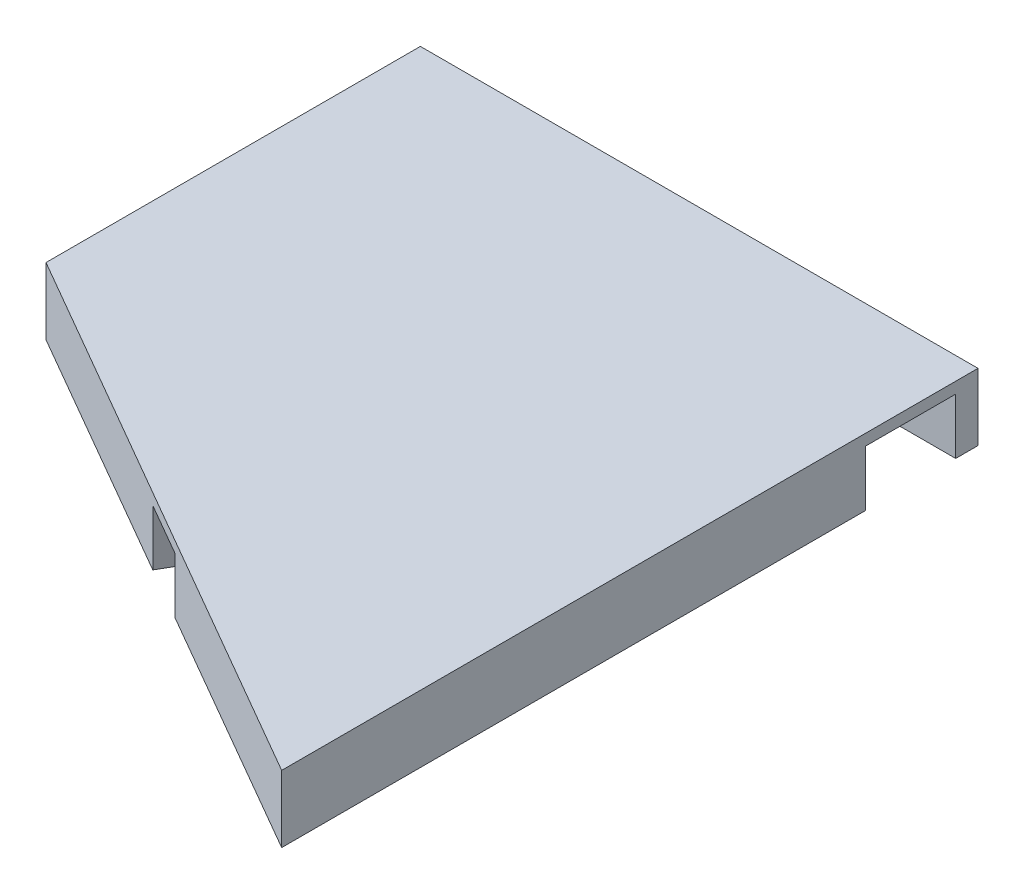
ISO-10303-21;
HEADER;
FILE_DESCRIPTION(('STEP AP214'),'2;1');
FILE_NAME('part.step','',(''),(''),'','','');
FILE_SCHEMA(('AUTOMOTIVE_DESIGN { 1 0 10303 214 1 1 1 1 }'));
ENDSEC;
DATA;
#1=APPLICATION_CONTEXT('core data for automotive mechanical design processes');
#2=APPLICATION_PROTOCOL_DEFINITION('international standard','automotive_design',2000,#1);
#3=PRODUCT_CONTEXT('',#1,'mechanical');
#4=PRODUCT('Part','Part','',(#3));
#5=PRODUCT_RELATED_PRODUCT_CATEGORY('part','',(#4));
#6=PRODUCT_DEFINITION_FORMATION('','',#4);
#7=PRODUCT_DEFINITION_CONTEXT('part definition',#1,'design');
#8=PRODUCT_DEFINITION('design','',#6,#7);
#9=PRODUCT_DEFINITION_SHAPE('','',#8);
#10=(LENGTH_UNIT() NAMED_UNIT(*) SI_UNIT(.MILLI.,.METRE.));
#11=(NAMED_UNIT(*) PLANE_ANGLE_UNIT() SI_UNIT($,.RADIAN.));
#12=(NAMED_UNIT(*) SI_UNIT($,.STERADIAN.) SOLID_ANGLE_UNIT());
#13=UNCERTAINTY_MEASURE_WITH_UNIT(LENGTH_MEASURE(1.E-05),#10,'distance_accuracy_value','');
#14=(GEOMETRIC_REPRESENTATION_CONTEXT(3) GLOBAL_UNCERTAINTY_ASSIGNED_CONTEXT((#13)) GLOBAL_UNIT_ASSIGNED_CONTEXT((#10,
#11,#12)) REPRESENTATION_CONTEXT('',''));
#15=CARTESIAN_POINT('',(0.,0.,0.));
#16=DIRECTION('',(0.,0.,1.));
#17=DIRECTION('',(1.,0.,0.));
#18=AXIS2_PLACEMENT_3D('',#15,#16,#17);
#19=CARTESIAN_POINT('',(0.,0.,0.));
#20=DIRECTION('',(-1.,0.,0.));
#21=DIRECTION('',(0.,0.,1.));
#22=AXIS2_PLACEMENT_3D('',#19,#20,#21);
#23=PLANE('',#22);
#24=DIRECTION('',(0.,1.,0.));
#25=VECTOR('',#24,1.);
#26=CARTESIAN_POINT('',(0.,5.,5.39999999999995));
#27=LINE('',#26,#25);
#28=CARTESIAN_POINT('',(0.,0.,5.39999999999996));
#29=VERTEX_POINT('',#28);
#30=CARTESIAN_POINT('',(0.,5.,5.39999999999996));
#31=VERTEX_POINT('',#30);
#32=EDGE_CURVE('E13',#29,#31,#27,.T.);
#33=ORIENTED_EDGE('',*,*,#32,.T.);
#34=DIRECTION('',(0.,0.,1.));
#35=VECTOR('',#34,1.);
#36=CARTESIAN_POINT('',(0.,5.,0.));
#37=LINE('',#36,#35);
#38=CARTESIAN_POINT('',(0.,5.,-2.7));
#39=VERTEX_POINT('',#38);
#40=EDGE_CURVE('E144',#39,#31,#37,.T.);
#41=ORIENTED_EDGE('',*,*,#40,.F.);
#42=DIRECTION('',(0.,-1.,0.));
#43=VECTOR('',#42,1.);
#44=CARTESIAN_POINT('',(0.,5.,-2.7));
#45=LINE('',#44,#43);
#46=CARTESIAN_POINT('',(0.,0.,-2.7));
#47=VERTEX_POINT('',#46);
#48=EDGE_CURVE('E257',#39,#47,#45,.T.);
#49=ORIENTED_EDGE('',*,*,#48,.T.);
#50=DIRECTION('',(0.,0.,1.));
#51=VECTOR('',#50,1.);
#52=CARTESIAN_POINT('',(0.,0.,0.));
#53=LINE('',#52,#51);
#54=CARTESIAN_POINT('',(0.,0.,-4.7));
#55=VERTEX_POINT('',#54);
#56=EDGE_CURVE('E262',#55,#47,#53,.T.);
#57=ORIENTED_EDGE('',*,*,#56,.F.);
#58=DIRECTION('',(0.,1.,0.));
#59=VECTOR('',#58,1.);
#60=CARTESIAN_POINT('',(0.,160.280048396847,-4.7));
#61=LINE('',#60,#59);
#62=CARTESIAN_POINT('',(0.,6.00000000000001,-4.7));
#63=VERTEX_POINT('',#62);
#64=EDGE_CURVE('E212',#55,#63,#61,.T.);
#65=ORIENTED_EDGE('',*,*,#64,.T.);
#66=DIRECTION('',(0.,0.,1.));
#67=VECTOR('',#66,1.);
#68=CARTESIAN_POINT('',(0.,6.,0.));
#69=LINE('',#68,#67);
#70=CARTESIAN_POINT('',(0.,6.,57.7350269189626));
#71=VERTEX_POINT('',#70);
#72=EDGE_CURVE('E258',#63,#71,#69,.T.);
#73=ORIENTED_EDGE('',*,*,#72,.T.);
#74=DIRECTION('',(0.,-1.,0.));
#75=VECTOR('',#74,1.);
#76=CARTESIAN_POINT('',(0.,6.,57.7350269189626));
#77=LINE('',#76,#75);
#78=CARTESIAN_POINT('',(0.,0.,57.7350269189626));
#79=VERTEX_POINT('',#78);
#80=EDGE_CURVE('E130',#71,#79,#77,.T.);
#81=ORIENTED_EDGE('',*,*,#80,.T.);
#82=DIRECTION('',(0.,0.,1.));
#83=VECTOR('',#82,1.);
#84=CARTESIAN_POINT('',(0.,0.,0.));
#85=LINE('',#84,#83);
#86=EDGE_CURVE('E124',#29,#79,#85,.T.);
#87=ORIENTED_EDGE('',*,*,#86,.F.);
#88=EDGE_LOOP('',(#33,#41,#49,#57,#65,#73,#81,#87));
#89=FACE_BOUND('',#88,.T.);
#90=ADVANCED_FACE('F121',(#89),#23,.F.);
#91=CARTESIAN_POINT('',(0.,0.,0.));
#92=DIRECTION('',(0.,1.,0.));
#93=DIRECTION('',(0.,0.,1.));
#94=AXIS2_PLACEMENT_3D('',#91,#92,#93);
#95=PLANE('',#94);
#96=DIRECTION('',(1.,0.,0.));
#97=VECTOR('',#96,1.);
#98=CARTESIAN_POINT('',(-50.,0.,-4.7));
#99=LINE('',#98,#97);
#100=CARTESIAN_POINT('',(-50.,0.,-4.7));
#101=VERTEX_POINT('',#100);
#102=EDGE_CURVE('E205',#101,#55,#99,.T.);
#103=ORIENTED_EDGE('',*,*,#102,.T.);
#104=ORIENTED_EDGE('',*,*,#56,.T.);
#105=DIRECTION('',(-1.,0.,0.));
#106=VECTOR('',#105,1.);
#107=CARTESIAN_POINT('',(50.,0.,-2.7));
#108=LINE('',#107,#106);
#109=CARTESIAN_POINT('',(-50.,0.,-2.7));
#110=VERTEX_POINT('',#109);
#111=EDGE_CURVE('E232',#47,#110,#108,.T.);
#112=ORIENTED_EDGE('',*,*,#111,.T.);
#113=DIRECTION('',(0.,0.,1.));
#114=VECTOR('',#113,1.);
#115=CARTESIAN_POINT('',(-50.,0.,0.));
#116=LINE('',#115,#114);
#117=EDGE_CURVE('E224',#101,#110,#116,.T.);
#118=ORIENTED_EDGE('',*,*,#117,.F.);
#119=EDGE_LOOP('',(#103,#104,#112,#118));
#120=FACE_BOUND('',#119,.T.);
#121=ADVANCED_FACE('F230',(#120),#95,.F.);
#122=CARTESIAN_POINT('',(-50.,6.,0.));
#123=DIRECTION('',(1.,0.,0.));
#124=DIRECTION('',(0.,0.,-1.));
#125=AXIS2_PLACEMENT_3D('',#122,#123,#124);
#126=PLANE('',#125);
#127=DIRECTION('',(0.,-1.,0.));
#128=VECTOR('',#127,1.);
#129=CARTESIAN_POINT('',(-50.,160.280048396847,-4.7));
#130=LINE('',#129,#128);
#131=CARTESIAN_POINT('',(-50.,6.,-4.7));
#132=VERTEX_POINT('',#131);
#133=EDGE_CURVE('E209',#132,#101,#130,.T.);
#134=ORIENTED_EDGE('',*,*,#133,.T.);
#135=ORIENTED_EDGE('',*,*,#117,.T.);
#136=DIRECTION('',(0.,-1.,0.));
#137=VECTOR('',#136,1.);
#138=CARTESIAN_POINT('',(-50.,5.,-2.7));
#139=LINE('',#138,#137);
#140=CARTESIAN_POINT('',(-50.,5.,-2.7));
#141=VERTEX_POINT('',#140);
#142=EDGE_CURVE('E314',#141,#110,#139,.T.);
#143=ORIENTED_EDGE('',*,*,#142,.F.);
#144=DIRECTION('',(0.,0.,1.));
#145=VECTOR('',#144,1.);
#146=CARTESIAN_POINT('',(-50.,5.,-2.7));
#147=LINE('',#146,#145);
#148=CARTESIAN_POINT('',(-50.,5.,2.7));
#149=VERTEX_POINT('',#148);
#150=EDGE_CURVE('E335',#141,#149,#147,.T.);
#151=ORIENTED_EDGE('',*,*,#150,.T.);
#152=DIRECTION('',(0.,-1.,0.));
#153=VECTOR('',#152,1.);
#154=CARTESIAN_POINT('',(-50.,5.,2.7));
#155=LINE('',#154,#153);
#156=CARTESIAN_POINT('',(-50.,0.,2.7));
#157=VERTEX_POINT('',#156);
#158=EDGE_CURVE('E321',#149,#157,#155,.T.);
#159=ORIENTED_EDGE('',*,*,#158,.T.);
#160=CARTESIAN_POINT('',(-50.,0.,28.8675134594813));
#161=VERTEX_POINT('',#160);
#162=EDGE_CURVE('E235',#157,#161,#116,.T.);
#163=ORIENTED_EDGE('',*,*,#162,.T.);
#164=DIRECTION('',(0.,-1.,0.));
#165=VECTOR('',#164,1.);
#166=CARTESIAN_POINT('',(-50.,6.,28.8675134594813));
#167=LINE('',#166,#165);
#168=CARTESIAN_POINT('',(-50.,6.,28.8675134594813));
#169=VERTEX_POINT('',#168);
#170=EDGE_CURVE('E251',#169,#161,#167,.T.);
#171=ORIENTED_EDGE('',*,*,#170,.F.);
#172=DIRECTION('',(0.,0.,1.));
#173=VECTOR('',#172,1.);
#174=CARTESIAN_POINT('',(-50.,6.,0.));
#175=LINE('',#174,#173);
#176=EDGE_CURVE('E227',#132,#169,#175,.T.);
#177=ORIENTED_EDGE('',*,*,#176,.F.);
#178=EDGE_LOOP('',(#134,#135,#143,#151,#159,#163,#171,#177));
#179=FACE_BOUND('',#178,.T.);
#180=ADVANCED_FACE('F222',(#179),#126,.F.);
#181=CARTESIAN_POINT('',(0.,6.,0.));
#182=DIRECTION('',(0.,1.,0.));
#183=DIRECTION('',(0.,0.,1.));
#184=AXIS2_PLACEMENT_3D('',#181,#182,#183);
#185=PLANE('',#184);
#186=ORIENTED_EDGE('',*,*,#72,.F.);
#187=DIRECTION('',(1.,0.,0.));
#188=VECTOR('',#187,1.);
#189=CARTESIAN_POINT('',(-50.,6.00000000000001,-4.7));
#190=LINE('',#189,#188);
#191=EDGE_CURVE('E217',#132,#63,#190,.T.);
#192=ORIENTED_EDGE('',*,*,#191,.F.);
#193=ORIENTED_EDGE('',*,*,#176,.T.);
#194=DIRECTION('',(0.866025403784439,0.,0.5));
#195=VECTOR('',#194,1.);
#196=CARTESIAN_POINT('',(-25.,6.,43.3012701892219));
#197=LINE('',#196,#195);
#198=EDGE_CURVE('E244',#169,#71,#197,.T.);
#199=ORIENTED_EDGE('',*,*,#198,.T.);
#200=EDGE_LOOP('',(#186,#192,#193,#199));
#201=FACE_BOUND('',#200,.T.);
#202=ADVANCED_FACE('F296',(#201),#185,.T.);
#203=DIRECTION('',(0.5,0.,-0.866025403784439));
#204=VECTOR('',#203,1.);
#205=CARTESIAN_POINT('',(-22.661731409782,0.,44.6512701892219));
#206=LINE('',#205,#204);
#207=CARTESIAN_POINT('',(-22.661731409782,0.,44.6512701892219));
#208=VERTEX_POINT('',#207);
#209=EDGE_CURVE('E273',#208,#29,#206,.T.);
#210=ORIENTED_EDGE('',*,*,#209,.T.);
#211=ORIENTED_EDGE('',*,*,#86,.T.);
#212=DIRECTION('',(0.866025403784439,0.,0.5));
#213=VECTOR('',#212,1.);
#214=CARTESIAN_POINT('',(-25.,0.,43.3012701892219));
#215=LINE('',#214,#213);
#216=EDGE_CURVE('E234',#208,#79,#215,.T.);
#217=ORIENTED_EDGE('',*,*,#216,.F.);
#218=EDGE_LOOP('',(#210,#211,#217));
#219=FACE_BOUND('',#218,.T.);
#220=ADVANCED_FACE('F272',(#219),#95,.F.);
#221=CARTESIAN_POINT('',(-25.,6.,43.3012701892219));
#222=DIRECTION('',(0.5,0.,-0.866025403784438));
#223=DIRECTION('',(-0.866025403784439,0.,-0.5));
#224=AXIS2_PLACEMENT_3D('',#221,#222,#223);
#225=PLANE('',#224);
#226=CARTESIAN_POINT('',(-27.338268590218,0.,41.9512701892219));
#227=VERTEX_POINT('',#226);
#228=EDGE_CURVE('E240',#161,#227,#215,.T.);
#229=ORIENTED_EDGE('',*,*,#228,.T.);
#230=DIRECTION('',(0.,-1.,0.));
#231=VECTOR('',#230,1.);
#232=CARTESIAN_POINT('',(-27.338268590218,5.,41.9512701892219));
#233=LINE('',#232,#231);
#234=CARTESIAN_POINT('',(-27.338268590218,5.,41.9512701892219));
#235=VERTEX_POINT('',#234);
#236=EDGE_CURVE('E242',#235,#227,#233,.T.);
#237=ORIENTED_EDGE('',*,*,#236,.F.);
#238=DIRECTION('',(0.866025403784439,0.,0.499999999999999));
#239=VECTOR('',#238,1.);
#240=CARTESIAN_POINT('',(-27.338268590218,5.,41.9512701892219));
#241=LINE('',#240,#239);
#242=CARTESIAN_POINT('',(-22.661731409782,5.,44.6512701892219));
#243=VERTEX_POINT('',#242);
#244=EDGE_CURVE('E282',#235,#243,#241,.T.);
#245=ORIENTED_EDGE('',*,*,#244,.T.);
#246=DIRECTION('',(0.,-1.,0.));
#247=VECTOR('',#246,1.);
#248=CARTESIAN_POINT('',(-22.661731409782,5.,44.6512701892219));
#249=LINE('',#248,#247);
#250=EDGE_CURVE('E280',#243,#208,#249,.T.);
#251=ORIENTED_EDGE('',*,*,#250,.T.);
#252=ORIENTED_EDGE('',*,*,#216,.T.);
#253=ORIENTED_EDGE('',*,*,#80,.F.);
#254=ORIENTED_EDGE('',*,*,#198,.F.);
#255=ORIENTED_EDGE('',*,*,#170,.T.);
#256=EDGE_LOOP('',(#229,#237,#245,#251,#252,#253,#254,#255));
#257=FACE_BOUND('',#256,.T.);
#258=ADVANCED_FACE('F278',(#257),#225,.F.);
#259=DIRECTION('',(-1.,0.,0.));
#260=VECTOR('',#259,1.);
#261=CARTESIAN_POINT('',(50.,0.,2.7));
#262=LINE('',#261,#260);
#263=CARTESIAN_POINT('',(-4.67653718043599,0.,2.7));
#264=VERTEX_POINT('',#263);
#265=EDGE_CURVE('E305',#264,#157,#262,.T.);
#266=ORIENTED_EDGE('',*,*,#265,.F.);
#267=DIRECTION('',(0.5,0.,-0.866025403784439));
#268=VECTOR('',#267,1.);
#269=CARTESIAN_POINT('',(-27.338268590218,0.,41.9512701892219));
#270=LINE('',#269,#268);
#271=EDGE_CURVE('E304',#227,#264,#270,.T.);
#272=ORIENTED_EDGE('',*,*,#271,.F.);
#273=ORIENTED_EDGE('',*,*,#228,.F.);
#274=ORIENTED_EDGE('',*,*,#162,.F.);
#275=EDGE_LOOP('',(#266,#272,#273,#274));
#276=FACE_BOUND('',#275,.T.);
#277=ADVANCED_FACE('F302',(#276),#95,.F.);
#278=CARTESIAN_POINT('',(-27.338268590218,5.,41.9512701892219));
#279=DIRECTION('',(-0.866025403784439,0.,-0.5));
#280=DIRECTION('',(-0.5,0.,0.866025403784439));
#281=AXIS2_PLACEMENT_3D('',#278,#279,#280);
#282=PLANE('',#281);
#283=DIRECTION('',(0.,1.,0.));
#284=VECTOR('',#283,1.);
#285=CARTESIAN_POINT('',(-4.67653718043599,5.,2.7));
#286=LINE('',#285,#284);
#287=CARTESIAN_POINT('',(-4.67653718043599,5.,2.7));
#288=VERTEX_POINT('',#287);
#289=EDGE_CURVE('E309',#264,#288,#286,.T.);
#290=ORIENTED_EDGE('',*,*,#289,.T.);
#291=DIRECTION('',(0.5,0.,-0.866025403784439));
#292=VECTOR('',#291,1.);
#293=CARTESIAN_POINT('',(-27.338268590218,5.,41.9512701892219));
#294=LINE('',#293,#292);
#295=EDGE_CURVE('E313',#235,#288,#294,.T.);
#296=ORIENTED_EDGE('',*,*,#295,.F.);
#297=ORIENTED_EDGE('',*,*,#236,.T.);
#298=ORIENTED_EDGE('',*,*,#271,.T.);
#299=EDGE_LOOP('',(#290,#296,#297,#298));
#300=FACE_BOUND('',#299,.T.);
#301=ADVANCED_FACE('F352',(#300),#282,.F.);
#302=CARTESIAN_POINT('',(-22.661731409782,5.,44.6512701892219));
#303=DIRECTION('',(-0.866025403784439,0.,-0.5));
#304=DIRECTION('',(-0.5,0.,0.866025403784439));
#305=AXIS2_PLACEMENT_3D('',#302,#303,#304);
#306=PLANE('',#305);
#307=ORIENTED_EDGE('',*,*,#209,.F.);
#308=ORIENTED_EDGE('',*,*,#250,.F.);
#309=DIRECTION('',(0.5,0.,-0.866025403784439));
#310=VECTOR('',#309,1.);
#311=CARTESIAN_POINT('',(-22.661731409782,5.,44.6512701892219));
#312=LINE('',#311,#310);
#313=EDGE_CURVE('E290',#243,#31,#312,.T.);
#314=ORIENTED_EDGE('',*,*,#313,.T.);
#315=ORIENTED_EDGE('',*,*,#32,.F.);
#316=EDGE_LOOP('',(#307,#308,#314,#315));
#317=FACE_BOUND('',#316,.T.);
#318=ADVANCED_FACE('F351',(#317),#306,.T.);
#319=CARTESIAN_POINT('',(0.,5.,0.));
#320=DIRECTION('',(0.,1.,0.));
#321=DIRECTION('',(-1.,0.,0.));
#322=AXIS2_PLACEMENT_3D('',#319,#320,#321);
#323=PLANE('',#322);
#324=DIRECTION('',(-1.,0.,0.));
#325=VECTOR('',#324,1.);
#326=CARTESIAN_POINT('',(50.,5.,-2.7));
#327=LINE('',#326,#325);
#328=EDGE_CURVE('E325',#39,#141,#327,.T.);
#329=ORIENTED_EDGE('',*,*,#328,.F.);
#330=ORIENTED_EDGE('',*,*,#40,.T.);
#331=ORIENTED_EDGE('',*,*,#313,.F.);
#332=ORIENTED_EDGE('',*,*,#244,.F.);
#333=ORIENTED_EDGE('',*,*,#295,.T.);
#334=DIRECTION('',(-1.,0.,0.));
#335=VECTOR('',#334,1.);
#336=CARTESIAN_POINT('',(50.,5.,2.7));
#337=LINE('',#336,#335);
#338=EDGE_CURVE('E330',#288,#149,#337,.T.);
#339=ORIENTED_EDGE('',*,*,#338,.T.);
#340=ORIENTED_EDGE('',*,*,#150,.F.);
#341=EDGE_LOOP('',(#329,#330,#331,#332,#333,#339,#340));
#342=FACE_BOUND('',#341,.T.);
#343=ADVANCED_FACE('F345',(#342),#323,.F.);
#344=CARTESIAN_POINT('',(50.,5.,2.7));
#345=DIRECTION('',(0.,0.,1.));
#346=DIRECTION('',(1.,0.,0.));
#347=AXIS2_PLACEMENT_3D('',#344,#345,#346);
#348=PLANE('',#347);
#349=ORIENTED_EDGE('',*,*,#265,.T.);
#350=ORIENTED_EDGE('',*,*,#158,.F.);
#351=ORIENTED_EDGE('',*,*,#338,.F.);
#352=ORIENTED_EDGE('',*,*,#289,.F.);
#353=EDGE_LOOP('',(#349,#350,#351,#352));
#354=FACE_BOUND('',#353,.T.);
#355=ADVANCED_FACE('F348',(#354),#348,.F.);
#356=CARTESIAN_POINT('',(50.,5.,-2.7));
#357=DIRECTION('',(0.,0.,1.));
#358=DIRECTION('',(1.,0.,0.));
#359=AXIS2_PLACEMENT_3D('',#356,#357,#358);
#360=PLANE('',#359);
#361=ORIENTED_EDGE('',*,*,#48,.F.);
#362=ORIENTED_EDGE('',*,*,#328,.T.);
#363=ORIENTED_EDGE('',*,*,#142,.T.);
#364=ORIENTED_EDGE('',*,*,#111,.F.);
#365=EDGE_LOOP('',(#361,#362,#363,#364));
#366=FACE_BOUND('',#365,.T.);
#367=ADVANCED_FACE('F350',(#366),#360,.T.);
#368=CARTESIAN_POINT('',(-50.,160.280048396847,-4.7));
#369=DIRECTION('',(0.,0.,-1.));
#370=DIRECTION('',(-1.,0.,0.));
#371=AXIS2_PLACEMENT_3D('',#368,#369,#370);
#372=PLANE('',#371);
#373=ORIENTED_EDGE('',*,*,#64,.F.);
#374=ORIENTED_EDGE('',*,*,#102,.F.);
#375=ORIENTED_EDGE('',*,*,#133,.F.);
#376=ORIENTED_EDGE('',*,*,#191,.T.);
#377=EDGE_LOOP('',(#373,#374,#375,#376));
#378=FACE_BOUND('',#377,.T.);
#379=ADVANCED_FACE('F207',(#378),#372,.T.);
#380=CLOSED_SHELL('',(#90,#121,#180,#202,#220,#258,#277,#301,#318,#343,#355,#367,#379));
#381=MANIFOLD_SOLID_BREP('B2',#380);
#382=ADVANCED_BREP_SHAPE_REPRESENTATION('',(#18,#381),#14);
#383=SHAPE_DEFINITION_REPRESENTATION(#9,#382);
ENDSEC;
END-ISO-10303-21;
